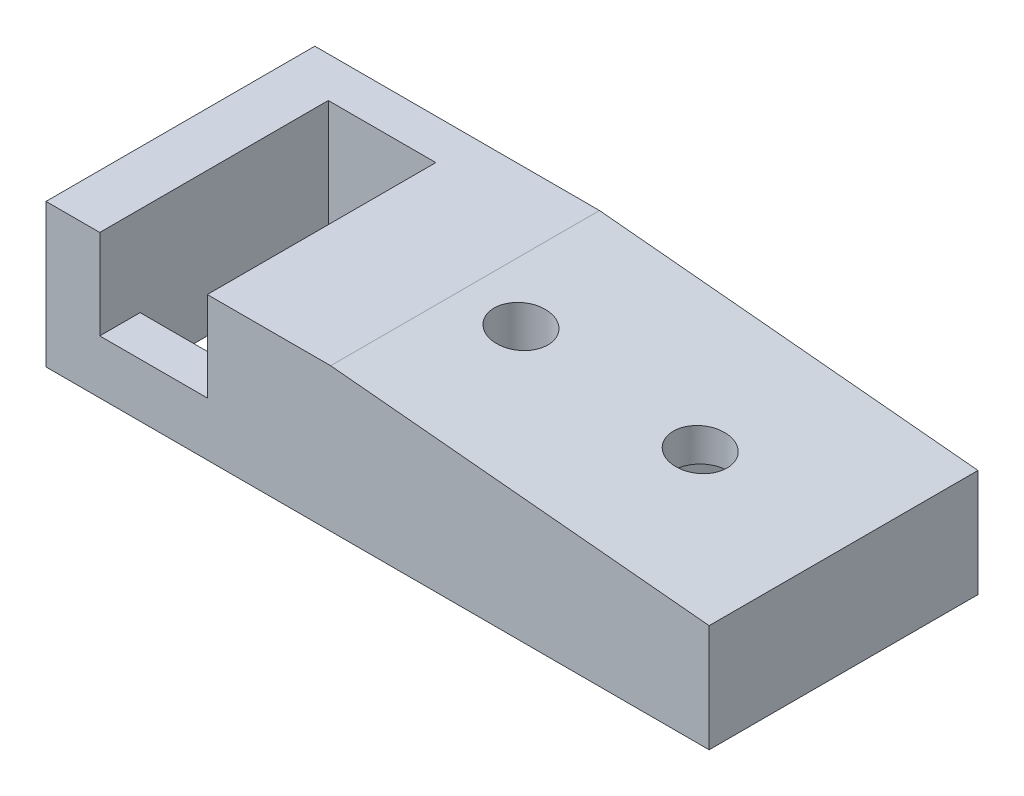
ISO-10303-21;
HEADER;
FILE_DESCRIPTION(('STEP AP214'),'2;1');
FILE_NAME('part.step','',(''),(''),'','','');
FILE_SCHEMA(('AUTOMOTIVE_DESIGN { 1 0 10303 214 1 1 1 1 }'));
ENDSEC;
DATA;
#1=APPLICATION_CONTEXT('core data for automotive mechanical design processes');
#2=APPLICATION_PROTOCOL_DEFINITION('international standard','automotive_design',2000,#1);
#3=PRODUCT_CONTEXT('',#1,'mechanical');
#4=PRODUCT('Part','Part','',(#3));
#5=PRODUCT_RELATED_PRODUCT_CATEGORY('part','',(#4));
#6=PRODUCT_DEFINITION_FORMATION('','',#4);
#7=PRODUCT_DEFINITION_CONTEXT('part definition',#1,'design');
#8=PRODUCT_DEFINITION('design','',#6,#7);
#9=PRODUCT_DEFINITION_SHAPE('','',#8);
#10=(LENGTH_UNIT() NAMED_UNIT(*) SI_UNIT(.MILLI.,.METRE.));
#11=(NAMED_UNIT(*) PLANE_ANGLE_UNIT() SI_UNIT($,.RADIAN.));
#12=(NAMED_UNIT(*) SI_UNIT($,.STERADIAN.) SOLID_ANGLE_UNIT());
#13=UNCERTAINTY_MEASURE_WITH_UNIT(LENGTH_MEASURE(1.E-05),#10,'distance_accuracy_value','');
#14=(GEOMETRIC_REPRESENTATION_CONTEXT(3) GLOBAL_UNCERTAINTY_ASSIGNED_CONTEXT((#13)) GLOBAL_UNIT_ASSIGNED_CONTEXT((#10,
#11,#12)) REPRESENTATION_CONTEXT('',''));
#15=CARTESIAN_POINT('',(0.,0.,0.));
#16=DIRECTION('',(0.,0.,1.));
#17=DIRECTION('',(1.,0.,0.));
#18=AXIS2_PLACEMENT_3D('',#15,#16,#17);
#19=CARTESIAN_POINT('',(5.,10.,2.5));
#20=DIRECTION('',(0.,-1.,0.));
#21=DIRECTION('',(0.,0.,-1.));
#22=AXIS2_PLACEMENT_3D('',#19,#20,#21);
#23=CYLINDRICAL_SURFACE('',#22,1.5);
#24=CARTESIAN_POINT('',(5.,2.,2.5));
#25=DIRECTION('',(0.,-1.,0.));
#26=DIRECTION('',(0.,0.,-1.));
#27=AXIS2_PLACEMENT_3D('',#24,#25,#26);
#28=CIRCLE('',#27,1.5);
#29=CARTESIAN_POINT('',(5.,2.,1.));
#30=VERTEX_POINT('',#29);
#31=EDGE_CURVE('E396',#30,#30,#28,.F.);
#32=ORIENTED_EDGE('',*,*,#31,.T.);
#33=EDGE_LOOP('',(#32));
#34=FACE_BOUND('',#33,.T.);
#35=CARTESIAN_POINT('',(5.,0.,2.5));
#36=DIRECTION('',(0.,-1.,0.));
#37=DIRECTION('',(0.,0.,-1.));
#38=AXIS2_PLACEMENT_3D('',#35,#36,#37);
#39=CIRCLE('',#38,1.5);
#40=CARTESIAN_POINT('',(5.,0.,1.));
#41=VERTEX_POINT('',#40);
#42=EDGE_CURVE('E243',#41,#41,#39,.T.);
#43=ORIENTED_EDGE('',*,*,#42,.T.);
#44=EDGE_LOOP('',(#43));
#45=FACE_BOUND('',#44,.T.);
#46=ADVANCED_FACE('F43',(#34,#45),#23,.F.);
#47=CARTESIAN_POINT('',(15.,10.,2.5));
#48=DIRECTION('',(0.,-1.,0.));
#49=DIRECTION('',(0.,0.,-1.));
#50=AXIS2_PLACEMENT_3D('',#47,#48,#49);
#51=CYLINDRICAL_SURFACE('',#50,1.5);
#52=CARTESIAN_POINT('',(15.,2.,2.5));
#53=DIRECTION('',(0.,-1.,0.));
#54=DIRECTION('',(0.,0.,-1.));
#55=AXIS2_PLACEMENT_3D('',#52,#53,#54);
#56=CIRCLE('',#55,1.5);
#57=CARTESIAN_POINT('',(15.,2.,0.999999999999999));
#58=VERTEX_POINT('',#57);
#59=EDGE_CURVE('E388',#58,#58,#56,.F.);
#60=ORIENTED_EDGE('',*,*,#59,.T.);
#61=EDGE_LOOP('',(#60));
#62=FACE_BOUND('',#61,.T.);
#63=CARTESIAN_POINT('',(15.,0.,2.5));
#64=DIRECTION('',(0.,-1.,0.));
#65=DIRECTION('',(0.,0.,-1.));
#66=AXIS2_PLACEMENT_3D('',#63,#64,#65);
#67=CIRCLE('',#66,1.5);
#68=CARTESIAN_POINT('',(15.,0.,0.999999999999999));
#69=VERTEX_POINT('',#68);
#70=EDGE_CURVE('E252',#69,#69,#67,.T.);
#71=ORIENTED_EDGE('',*,*,#70,.T.);
#72=EDGE_LOOP('',(#71));
#73=FACE_BOUND('',#72,.T.);
#74=ADVANCED_FACE('F447',(#62,#73),#51,.F.);
#75=CARTESIAN_POINT('',(23.,6.,5.));
#76=DIRECTION('',(-0.0942820702261732,-0.995545524440679,0.));
#77=DIRECTION('',(0.995545524440679,-0.0942820702261732,0.));
#78=AXIS2_PLACEMENT_3D('',#75,#76,#77);
#79=PLANE('',#78);
#80=DIRECTION('',(0.995545524440679,-0.0942820702261732,0.));
#81=VECTOR('',#80,1.);
#82=CARTESIAN_POINT('',(0.767622059913071,8.10549348752258,-5.));
#83=LINE('',#82,#81);
#84=CARTESIAN_POINT('',(1.88155145400466,8.,-5.));
#85=VERTEX_POINT('',#84);
#86=CARTESIAN_POINT('',(23.,6.,-5.));
#87=VERTEX_POINT('',#86);
#88=EDGE_CURVE('E287',#85,#87,#83,.T.);
#89=ORIENTED_EDGE('',*,*,#88,.F.);
#90=DIRECTION('',(0.,0.,-1.));
#91=VECTOR('',#90,1.);
#92=CARTESIAN_POINT('',(1.88155145400469,8.,0.));
#93=LINE('',#92,#91);
#94=CARTESIAN_POINT('',(1.88155145400466,8.,10.));
#95=VERTEX_POINT('',#94);
#96=EDGE_CURVE('E12',#95,#85,#93,.T.);
#97=ORIENTED_EDGE('',*,*,#96,.F.);
#98=DIRECTION('',(0.995545524440679,-0.0942820702261732,0.));
#99=VECTOR('',#98,1.);
#100=CARTESIAN_POINT('',(0.767622059913071,8.10549348752258,10.));
#101=LINE('',#100,#99);
#102=CARTESIAN_POINT('',(23.,6.,10.));
#103=VERTEX_POINT('',#102);
#104=EDGE_CURVE('E291',#95,#103,#101,.T.);
#105=ORIENTED_EDGE('',*,*,#104,.T.);
#106=DIRECTION('',(0.,0.,-1.));
#107=VECTOR('',#106,1.);
#108=CARTESIAN_POINT('',(23.,6.,5.));
#109=LINE('',#108,#107);
#110=EDGE_CURVE('E267',#103,#87,#109,.T.);
#111=ORIENTED_EDGE('',*,*,#110,.T.);
#112=EDGE_LOOP('',(#89,#97,#105,#111));
#113=FACE_BOUND('',#112,.T.);
#114=CARTESIAN_POINT('',(5.,7.7046706779427,2.5));
#115=DIRECTION('',(-0.0942820702261732,-0.995545524440679,0.));
#116=DIRECTION('',(0.995545524440679,-0.0942820702261732,0.));
#117=AXIS2_PLACEMENT_3D('',#114,#115,#116);
#118=ELLIPSE('',#117,1.50671161004188,1.5);
#119=CARTESIAN_POINT('',(6.5,7.56261478811415,2.5));
#120=VERTEX_POINT('',#119);
#121=EDGE_CURVE('E256',#120,#120,#118,.T.);
#122=ORIENTED_EDGE('',*,*,#121,.T.);
#123=EDGE_LOOP('',(#122));
#124=FACE_BOUND('',#123,.T.);
#125=CARTESIAN_POINT('',(15.,6.75763141241898,2.5));
#126=DIRECTION('',(-0.0942820702261732,-0.995545524440679,0.));
#127=DIRECTION('',(0.995545524440679,-0.0942820702261732,0.));
#128=AXIS2_PLACEMENT_3D('',#125,#126,#127);
#129=ELLIPSE('',#128,1.50671161004188,1.5);
#130=CARTESIAN_POINT('',(16.5,6.61557552259042,2.5));
#131=VERTEX_POINT('',#130);
#132=EDGE_CURVE('E263',#131,#131,#129,.T.);
#133=ORIENTED_EDGE('',*,*,#132,.T.);
#134=EDGE_LOOP('',(#133));
#135=FACE_BOUND('',#134,.T.);
#136=ADVANCED_FACE('F45',(#113,#124,#135),#79,.F.);
#137=CARTESIAN_POINT('',(0.,0.,5.));
#138=DIRECTION('',(0.,1.,0.));
#139=DIRECTION('',(0.,0.,1.));
#140=AXIS2_PLACEMENT_3D('',#137,#138,#139);
#141=PLANE('',#140);
#142=DIRECTION('',(0.,0.,-1.));
#143=VECTOR('',#142,1.);
#144=CARTESIAN_POINT('',(23.,0.,5.));
#145=LINE('',#144,#143);
#146=CARTESIAN_POINT('',(23.,0.,10.));
#147=VERTEX_POINT('',#146);
#148=CARTESIAN_POINT('',(23.,0.,-5.));
#149=VERTEX_POINT('',#148);
#150=EDGE_CURVE('E52',#147,#149,#145,.T.);
#151=ORIENTED_EDGE('',*,*,#150,.F.);
#152=DIRECTION('',(-1.,0.,0.));
#153=VECTOR('',#152,1.);
#154=CARTESIAN_POINT('',(23.,0.,10.));
#155=LINE('',#154,#153);
#156=CARTESIAN_POINT('',(-14.,0.,10.));
#157=VERTEX_POINT('',#156);
#158=EDGE_CURVE('E206',#147,#157,#155,.T.);
#159=ORIENTED_EDGE('',*,*,#158,.T.);
#160=DIRECTION('',(0.,0.,-1.));
#161=VECTOR('',#160,1.);
#162=CARTESIAN_POINT('',(-14.,0.,-5.));
#163=LINE('',#162,#161);
#164=CARTESIAN_POINT('',(-14.,0.,-5.));
#165=VERTEX_POINT('',#164);
#166=EDGE_CURVE('E232',#157,#165,#163,.T.);
#167=ORIENTED_EDGE('',*,*,#166,.T.);
#168=DIRECTION('',(1.,0.,0.));
#169=VECTOR('',#168,1.);
#170=CARTESIAN_POINT('',(23.,0.,-5.));
#171=LINE('',#170,#169);
#172=EDGE_CURVE('E236',#165,#149,#171,.T.);
#173=ORIENTED_EDGE('',*,*,#172,.T.);
#174=EDGE_LOOP('',(#151,#159,#167,#173));
#175=FACE_BOUND('',#174,.T.);
#176=ORIENTED_EDGE('',*,*,#70,.F.);
#177=EDGE_LOOP('',(#176));
#178=FACE_BOUND('',#177,.T.);
#179=ORIENTED_EDGE('',*,*,#42,.F.);
#180=EDGE_LOOP('',(#179));
#181=FACE_BOUND('',#180,.T.);
#182=DIRECTION('',(1.,0.,0.));
#183=VECTOR('',#182,1.);
#184=CARTESIAN_POINT('',(-11.,0.,-2.75));
#185=LINE('',#184,#183);
#186=CARTESIAN_POINT('',(-11.,0.,-2.75));
#187=VERTEX_POINT('',#186);
#188=CARTESIAN_POINT('',(-5.,0.,-2.75));
#189=VERTEX_POINT('',#188);
#190=EDGE_CURVE('E400',#187,#189,#185,.T.);
#191=ORIENTED_EDGE('',*,*,#190,.F.);
#192=DIRECTION('',(0.,0.,-1.));
#193=VECTOR('',#192,1.);
#194=CARTESIAN_POINT('',(-11.,0.,-2.75));
#195=LINE('',#194,#193);
#196=CARTESIAN_POINT('',(-11.,0.,7.75));
#197=VERTEX_POINT('',#196);
#198=EDGE_CURVE('E406',#197,#187,#195,.T.);
#199=ORIENTED_EDGE('',*,*,#198,.F.);
#200=DIRECTION('',(-1.,0.,0.));
#201=VECTOR('',#200,1.);
#202=CARTESIAN_POINT('',(-11.,0.,7.75));
#203=LINE('',#202,#201);
#204=CARTESIAN_POINT('',(-5.,0.,7.75));
#205=VERTEX_POINT('',#204);
#206=EDGE_CURVE('E198',#205,#197,#203,.T.);
#207=ORIENTED_EDGE('',*,*,#206,.F.);
#208=DIRECTION('',(0.,0.,1.));
#209=VECTOR('',#208,1.);
#210=CARTESIAN_POINT('',(-5.,0.,7.75));
#211=LINE('',#210,#209);
#212=EDGE_CURVE('E414',#189,#205,#211,.T.);
#213=ORIENTED_EDGE('',*,*,#212,.F.);
#214=EDGE_LOOP('',(#191,#199,#207,#213));
#215=FACE_BOUND('',#214,.T.);
#216=ADVANCED_FACE('F279',(#175,#178,#181,#215),#141,.F.);
#217=CARTESIAN_POINT('',(23.,0.,5.));
#218=DIRECTION('',(-1.,0.,0.));
#219=DIRECTION('',(0.,0.,1.));
#220=AXIS2_PLACEMENT_3D('',#217,#218,#219);
#221=PLANE('',#220);
#222=DIRECTION('',(0.,-1.,0.));
#223=VECTOR('',#222,1.);
#224=CARTESIAN_POINT('',(23.,8.,-5.));
#225=LINE('',#224,#223);
#226=EDGE_CURVE('E240',#87,#149,#225,.T.);
#227=ORIENTED_EDGE('',*,*,#226,.F.);
#228=ORIENTED_EDGE('',*,*,#110,.F.);
#229=DIRECTION('',(0.,-1.,0.));
#230=VECTOR('',#229,1.);
#231=CARTESIAN_POINT('',(23.,8.,10.));
#232=LINE('',#231,#230);
#233=EDGE_CURVE('E228',#103,#147,#232,.T.);
#234=ORIENTED_EDGE('',*,*,#233,.T.);
#235=ORIENTED_EDGE('',*,*,#150,.T.);
#236=EDGE_LOOP('',(#227,#228,#234,#235));
#237=FACE_BOUND('',#236,.T.);
#238=ADVANCED_FACE('F274',(#237),#221,.F.);
#239=CARTESIAN_POINT('',(5.,5.,2.5));
#240=DIRECTION('',(0.,1.,0.));
#241=DIRECTION('',(0.,0.,1.));
#242=AXIS2_PLACEMENT_3D('',#239,#240,#241);
#243=CIRCLE('',#242,1.5);
#244=CARTESIAN_POINT('',(5.,5.,4.));
#245=VERTEX_POINT('',#244);
#246=EDGE_CURVE('E392',#245,#245,#243,.F.);
#247=ORIENTED_EDGE('',*,*,#246,.T.);
#248=EDGE_LOOP('',(#247));
#249=FACE_BOUND('',#248,.T.);
#250=ORIENTED_EDGE('',*,*,#121,.F.);
#251=EDGE_LOOP('',(#250));
#252=FACE_BOUND('',#251,.T.);
#253=ADVANCED_FACE('F454',(#249,#252),#23,.F.);
#254=CARTESIAN_POINT('',(15.,5.,2.5));
#255=DIRECTION('',(0.,1.,0.));
#256=DIRECTION('',(-1.,0.,0.));
#257=AXIS2_PLACEMENT_3D('',#254,#255,#256);
#258=CIRCLE('',#257,1.5);
#259=CARTESIAN_POINT('',(13.5,5.,2.5));
#260=VERTEX_POINT('',#259);
#261=EDGE_CURVE('E338',#260,#260,#258,.F.);
#262=ORIENTED_EDGE('',*,*,#261,.T.);
#263=EDGE_LOOP('',(#262));
#264=FACE_BOUND('',#263,.T.);
#265=ORIENTED_EDGE('',*,*,#132,.F.);
#266=EDGE_LOOP('',(#265));
#267=FACE_BOUND('',#266,.T.);
#268=ADVANCED_FACE('F452',(#264,#267),#51,.F.);
#269=CARTESIAN_POINT('',(23.,8.,-5.));
#270=DIRECTION('',(0.,0.,-1.));
#271=DIRECTION('',(-1.,0.,0.));
#272=AXIS2_PLACEMENT_3D('',#269,#270,#271);
#273=PLANE('',#272);
#274=ORIENTED_EDGE('',*,*,#88,.T.);
#275=ORIENTED_EDGE('',*,*,#226,.T.);
#276=ORIENTED_EDGE('',*,*,#172,.F.);
#277=DIRECTION('',(0.,-1.,0.));
#278=VECTOR('',#277,1.);
#279=CARTESIAN_POINT('',(-14.,8.,-5.));
#280=LINE('',#279,#278);
#281=CARTESIAN_POINT('',(-14.,8.,-5.));
#282=VERTEX_POINT('',#281);
#283=EDGE_CURVE('E244',#282,#165,#280,.T.);
#284=ORIENTED_EDGE('',*,*,#283,.F.);
#285=DIRECTION('',(1.,0.,0.));
#286=VECTOR('',#285,1.);
#287=CARTESIAN_POINT('',(23.,8.,-5.));
#288=LINE('',#287,#286);
#289=EDGE_CURVE('E225',#282,#85,#288,.T.);
#290=ORIENTED_EDGE('',*,*,#289,.T.);
#291=EDGE_LOOP('',(#274,#275,#276,#284,#290));
#292=FACE_BOUND('',#291,.T.);
#293=DIRECTION('',(0.,1.,0.));
#294=VECTOR('',#293,1.);
#295=CARTESIAN_POINT('',(7.75,2.,-5.));
#296=LINE('',#295,#294);
#297=CARTESIAN_POINT('',(7.75,2.,-5.));
#298=VERTEX_POINT('',#297);
#299=CARTESIAN_POINT('',(7.75,5.,-5.));
#300=VERTEX_POINT('',#299);
#301=EDGE_CURVE('E303',#298,#300,#296,.T.);
#302=ORIENTED_EDGE('',*,*,#301,.T.);
#303=DIRECTION('',(-1.,0.,0.));
#304=VECTOR('',#303,1.);
#305=CARTESIAN_POINT('',(2.25,5.,-5.));
#306=LINE('',#305,#304);
#307=CARTESIAN_POINT('',(2.25,5.,-5.));
#308=VERTEX_POINT('',#307);
#309=EDGE_CURVE('E307',#300,#308,#306,.T.);
#310=ORIENTED_EDGE('',*,*,#309,.T.);
#311=DIRECTION('',(0.,-1.,0.));
#312=VECTOR('',#311,1.);
#313=CARTESIAN_POINT('',(2.25,2.,-5.));
#314=LINE('',#313,#312);
#315=CARTESIAN_POINT('',(2.25,2.,-5.));
#316=VERTEX_POINT('',#315);
#317=EDGE_CURVE('E65',#308,#316,#314,.T.);
#318=ORIENTED_EDGE('',*,*,#317,.T.);
#319=DIRECTION('',(1.,0.,0.));
#320=VECTOR('',#319,1.);
#321=CARTESIAN_POINT('',(2.25,2.,-5.));
#322=LINE('',#321,#320);
#323=EDGE_CURVE('E314',#316,#298,#322,.T.);
#324=ORIENTED_EDGE('',*,*,#323,.T.);
#325=EDGE_LOOP('',(#302,#310,#318,#324));
#326=FACE_BOUND('',#325,.T.);
#327=DIRECTION('',(0.,1.,0.));
#328=VECTOR('',#327,1.);
#329=CARTESIAN_POINT('',(17.75,5.,-5.));
#330=LINE('',#329,#328);
#331=CARTESIAN_POINT('',(17.75,2.,-5.));
#332=VERTEX_POINT('',#331);
#333=CARTESIAN_POINT('',(17.75,5.,-5.));
#334=VERTEX_POINT('',#333);
#335=EDGE_CURVE('E347',#332,#334,#330,.T.);
#336=ORIENTED_EDGE('',*,*,#335,.T.);
#337=DIRECTION('',(-1.,0.,0.));
#338=VECTOR('',#337,1.);
#339=CARTESIAN_POINT('',(12.25,5.,-5.));
#340=LINE('',#339,#338);
#341=CARTESIAN_POINT('',(12.25,5.,-5.));
#342=VERTEX_POINT('',#341);
#343=EDGE_CURVE('E351',#334,#342,#340,.T.);
#344=ORIENTED_EDGE('',*,*,#343,.T.);
#345=DIRECTION('',(0.,-1.,0.));
#346=VECTOR('',#345,1.);
#347=CARTESIAN_POINT('',(12.25,5.,-5.));
#348=LINE('',#347,#346);
#349=CARTESIAN_POINT('',(12.25,2.,-5.));
#350=VERTEX_POINT('',#349);
#351=EDGE_CURVE('E356',#342,#350,#348,.T.);
#352=ORIENTED_EDGE('',*,*,#351,.T.);
#353=DIRECTION('',(1.,0.,0.));
#354=VECTOR('',#353,1.);
#355=CARTESIAN_POINT('',(12.25,2.,-5.));
#356=LINE('',#355,#354);
#357=EDGE_CURVE('E360',#350,#332,#356,.T.);
#358=ORIENTED_EDGE('',*,*,#357,.T.);
#359=EDGE_LOOP('',(#336,#344,#352,#358));
#360=FACE_BOUND('',#359,.T.);
#361=ADVANCED_FACE('F284',(#292,#326,#360),#273,.T.);
#362=CARTESIAN_POINT('',(-14.,8.,-5.));
#363=DIRECTION('',(-1.,0.,0.));
#364=DIRECTION('',(0.,0.,1.));
#365=AXIS2_PLACEMENT_3D('',#362,#363,#364);
#366=PLANE('',#365);
#367=ORIENTED_EDGE('',*,*,#166,.F.);
#368=DIRECTION('',(0.,-1.,0.));
#369=VECTOR('',#368,1.);
#370=CARTESIAN_POINT('',(-14.,8.,10.));
#371=LINE('',#370,#369);
#372=CARTESIAN_POINT('',(-14.,8.,10.));
#373=VERTEX_POINT('',#372);
#374=EDGE_CURVE('E247',#373,#157,#371,.T.);
#375=ORIENTED_EDGE('',*,*,#374,.F.);
#376=DIRECTION('',(0.,0.,-1.));
#377=VECTOR('',#376,1.);
#378=CARTESIAN_POINT('',(-14.,8.,-5.));
#379=LINE('',#378,#377);
#380=EDGE_CURVE('E220',#373,#282,#379,.T.);
#381=ORIENTED_EDGE('',*,*,#380,.T.);
#382=ORIENTED_EDGE('',*,*,#283,.T.);
#383=EDGE_LOOP('',(#367,#375,#381,#382));
#384=FACE_BOUND('',#383,.T.);
#385=ADVANCED_FACE('F461',(#384),#366,.T.);
#386=CARTESIAN_POINT('',(23.,8.,10.));
#387=DIRECTION('',(0.,0.,1.));
#388=DIRECTION('',(1.,0.,0.));
#389=AXIS2_PLACEMENT_3D('',#386,#387,#388);
#390=PLANE('',#389);
#391=DIRECTION('',(0.,1.,0.));
#392=VECTOR('',#391,1.);
#393=CARTESIAN_POINT('',(-5.,3.,10.));
#394=LINE('',#393,#392);
#395=CARTESIAN_POINT('',(-5.,3.,10.));
#396=VERTEX_POINT('',#395);
#397=CARTESIAN_POINT('',(-5.,8.,10.));
#398=VERTEX_POINT('',#397);
#399=EDGE_CURVE('E299',#396,#398,#394,.T.);
#400=ORIENTED_EDGE('',*,*,#399,.F.);
#401=DIRECTION('',(1.,0.,0.));
#402=VECTOR('',#401,1.);
#403=CARTESIAN_POINT('',(-5.,3.,10.));
#404=LINE('',#403,#402);
#405=CARTESIAN_POINT('',(-11.,3.,10.));
#406=VERTEX_POINT('',#405);
#407=EDGE_CURVE('E185',#406,#396,#404,.T.);
#408=ORIENTED_EDGE('',*,*,#407,.F.);
#409=DIRECTION('',(0.,1.,0.));
#410=VECTOR('',#409,1.);
#411=CARTESIAN_POINT('',(-11.,3.,10.));
#412=LINE('',#411,#410);
#413=CARTESIAN_POINT('',(-11.,8.,10.));
#414=VERTEX_POINT('',#413);
#415=EDGE_CURVE('E181',#406,#414,#412,.T.);
#416=ORIENTED_EDGE('',*,*,#415,.T.);
#417=DIRECTION('',(-1.,0.,0.));
#418=VECTOR('',#417,1.);
#419=CARTESIAN_POINT('',(23.,8.,10.));
#420=LINE('',#419,#418);
#421=EDGE_CURVE('E221',#414,#373,#420,.T.);
#422=ORIENTED_EDGE('',*,*,#421,.T.);
#423=ORIENTED_EDGE('',*,*,#374,.T.);
#424=ORIENTED_EDGE('',*,*,#158,.F.);
#425=ORIENTED_EDGE('',*,*,#233,.F.);
#426=ORIENTED_EDGE('',*,*,#104,.F.);
#427=EDGE_CURVE('E216',#95,#398,#420,.T.);
#428=ORIENTED_EDGE('',*,*,#427,.T.);
#429=EDGE_LOOP('',(#400,#408,#416,#422,#423,#424,#425,#426,#428));
#430=FACE_BOUND('',#429,.T.);
#431=ADVANCED_FACE('F435',(#430),#390,.T.);
#432=CARTESIAN_POINT('',(0.,8.,0.));
#433=DIRECTION('',(0.,-1.,0.));
#434=DIRECTION('',(0.,0.,-1.));
#435=AXIS2_PLACEMENT_3D('',#432,#433,#434);
#436=PLANE('',#435);
#437=DIRECTION('',(0.,0.,1.));
#438=VECTOR('',#437,1.);
#439=CARTESIAN_POINT('',(-5.,8.,7.75));
#440=LINE('',#439,#438);
#441=CARTESIAN_POINT('',(-5.,8.,-2.75));
#442=VERTEX_POINT('',#441);
#443=EDGE_CURVE('E405',#442,#398,#440,.T.);
#444=ORIENTED_EDGE('',*,*,#443,.T.);
#445=ORIENTED_EDGE('',*,*,#427,.F.);
#446=ORIENTED_EDGE('',*,*,#96,.T.);
#447=ORIENTED_EDGE('',*,*,#289,.F.);
#448=ORIENTED_EDGE('',*,*,#380,.F.);
#449=ORIENTED_EDGE('',*,*,#421,.F.);
#450=DIRECTION('',(0.,0.,-1.));
#451=VECTOR('',#450,1.);
#452=CARTESIAN_POINT('',(-11.,8.,-2.75));
#453=LINE('',#452,#451);
#454=CARTESIAN_POINT('',(-11.,8.,-2.75));
#455=VERTEX_POINT('',#454);
#456=EDGE_CURVE('E215',#414,#455,#453,.T.);
#457=ORIENTED_EDGE('',*,*,#456,.T.);
#458=DIRECTION('',(1.,0.,0.));
#459=VECTOR('',#458,1.);
#460=CARTESIAN_POINT('',(-11.,8.,-2.75));
#461=LINE('',#460,#459);
#462=EDGE_CURVE('E401',#455,#442,#461,.T.);
#463=ORIENTED_EDGE('',*,*,#462,.T.);
#464=EDGE_LOOP('',(#444,#445,#446,#447,#448,#449,#457,#463));
#465=FACE_BOUND('',#464,.T.);
#466=ADVANCED_FACE('F431',(#465),#436,.F.);
#467=CARTESIAN_POINT('',(-11.,8.,-2.75));
#468=DIRECTION('',(0.,0.,-1.));
#469=DIRECTION('',(-1.,0.,0.));
#470=AXIS2_PLACEMENT_3D('',#467,#468,#469);
#471=PLANE('',#470);
#472=ORIENTED_EDGE('',*,*,#190,.T.);
#473=DIRECTION('',(0.,-1.,0.));
#474=VECTOR('',#473,1.);
#475=CARTESIAN_POINT('',(-5.,8.,-2.75));
#476=LINE('',#475,#474);
#477=EDGE_CURVE('E208',#442,#189,#476,.T.);
#478=ORIENTED_EDGE('',*,*,#477,.F.);
#479=ORIENTED_EDGE('',*,*,#462,.F.);
#480=DIRECTION('',(0.,-1.,0.));
#481=VECTOR('',#480,1.);
#482=CARTESIAN_POINT('',(-11.,8.,-2.75));
#483=LINE('',#482,#481);
#484=EDGE_CURVE('E201',#455,#187,#483,.T.);
#485=ORIENTED_EDGE('',*,*,#484,.T.);
#486=EDGE_LOOP('',(#472,#478,#479,#485));
#487=FACE_BOUND('',#486,.T.);
#488=ADVANCED_FACE('F425',(#487),#471,.F.);
#489=CARTESIAN_POINT('',(-11.,8.,-2.75));
#490=DIRECTION('',(-1.,0.,0.));
#491=DIRECTION('',(0.,0.,1.));
#492=AXIS2_PLACEMENT_3D('',#489,#490,#491);
#493=PLANE('',#492);
#494=ORIENTED_EDGE('',*,*,#198,.T.);
#495=ORIENTED_EDGE('',*,*,#484,.F.);
#496=ORIENTED_EDGE('',*,*,#456,.F.);
#497=ORIENTED_EDGE('',*,*,#415,.F.);
#498=DIRECTION('',(0.,0.,1.));
#499=VECTOR('',#498,1.);
#500=CARTESIAN_POINT('',(-11.,3.,7.75));
#501=LINE('',#500,#499);
#502=CARTESIAN_POINT('',(-11.,3.,7.75));
#503=VERTEX_POINT('',#502);
#504=EDGE_CURVE('E173',#503,#406,#501,.T.);
#505=ORIENTED_EDGE('',*,*,#504,.F.);
#506=DIRECTION('',(0.,-1.,0.));
#507=VECTOR('',#506,1.);
#508=CARTESIAN_POINT('',(-11.,8.,7.75));
#509=LINE('',#508,#507);
#510=EDGE_CURVE('E178',#503,#197,#509,.T.);
#511=ORIENTED_EDGE('',*,*,#510,.T.);
#512=EDGE_LOOP('',(#494,#495,#496,#497,#505,#511));
#513=FACE_BOUND('',#512,.T.);
#514=ADVANCED_FACE('F176',(#513),#493,.F.);
#515=CARTESIAN_POINT('',(-11.,8.,7.75));
#516=DIRECTION('',(0.,0.,1.));
#517=DIRECTION('',(1.,0.,0.));
#518=AXIS2_PLACEMENT_3D('',#515,#516,#517);
#519=PLANE('',#518);
#520=ORIENTED_EDGE('',*,*,#510,.F.);
#521=DIRECTION('',(-1.,0.,0.));
#522=VECTOR('',#521,1.);
#523=CARTESIAN_POINT('',(-11.,3.,7.75));
#524=LINE('',#523,#522);
#525=CARTESIAN_POINT('',(-5.,3.,7.75));
#526=VERTEX_POINT('',#525);
#527=EDGE_CURVE('E186',#526,#503,#524,.T.);
#528=ORIENTED_EDGE('',*,*,#527,.F.);
#529=DIRECTION('',(0.,-1.,0.));
#530=VECTOR('',#529,1.);
#531=CARTESIAN_POINT('',(-5.,8.,7.75));
#532=LINE('',#531,#530);
#533=EDGE_CURVE('E202',#526,#205,#532,.T.);
#534=ORIENTED_EDGE('',*,*,#533,.T.);
#535=ORIENTED_EDGE('',*,*,#206,.T.);
#536=EDGE_LOOP('',(#520,#528,#534,#535));
#537=FACE_BOUND('',#536,.T.);
#538=ADVANCED_FACE('F196',(#537),#519,.F.);
#539=CARTESIAN_POINT('',(-5.,8.,7.75));
#540=DIRECTION('',(1.,0.,0.));
#541=DIRECTION('',(0.,0.,-1.));
#542=AXIS2_PLACEMENT_3D('',#539,#540,#541);
#543=PLANE('',#542);
#544=ORIENTED_EDGE('',*,*,#212,.T.);
#545=ORIENTED_EDGE('',*,*,#533,.F.);
#546=DIRECTION('',(0.,0.,-1.));
#547=VECTOR('',#546,1.);
#548=CARTESIAN_POINT('',(-5.,3.,7.75));
#549=LINE('',#548,#547);
#550=EDGE_CURVE('E191',#396,#526,#549,.T.);
#551=ORIENTED_EDGE('',*,*,#550,.F.);
#552=ORIENTED_EDGE('',*,*,#399,.T.);
#553=ORIENTED_EDGE('',*,*,#443,.F.);
#554=ORIENTED_EDGE('',*,*,#477,.T.);
#555=EDGE_LOOP('',(#544,#545,#551,#552,#553,#554));
#556=FACE_BOUND('',#555,.T.);
#557=ADVANCED_FACE('F428',(#556),#543,.F.);
#558=CARTESIAN_POINT('',(12.25,2.,-5.));
#559=DIRECTION('',(0.,-1.,0.));
#560=DIRECTION('',(0.,0.,-1.));
#561=AXIS2_PLACEMENT_3D('',#558,#559,#560);
#562=PLANE('',#561);
#563=DIRECTION('',(1.,0.,0.));
#564=VECTOR('',#563,1.);
#565=CARTESIAN_POINT('',(12.25,2.,5.));
#566=LINE('',#565,#564);
#567=CARTESIAN_POINT('',(12.25,2.,5.));
#568=VERTEX_POINT('',#567);
#569=CARTESIAN_POINT('',(17.75,2.,5.));
#570=VERTEX_POINT('',#569);
#571=EDGE_CURVE('E352',#568,#570,#566,.T.);
#572=ORIENTED_EDGE('',*,*,#571,.T.);
#573=DIRECTION('',(0.,0.,1.));
#574=VECTOR('',#573,1.);
#575=CARTESIAN_POINT('',(17.75,2.,-5.));
#576=LINE('',#575,#574);
#577=EDGE_CURVE('E324',#332,#570,#576,.T.);
#578=ORIENTED_EDGE('',*,*,#577,.F.);
#579=ORIENTED_EDGE('',*,*,#357,.F.);
#580=DIRECTION('',(0.,0.,1.));
#581=VECTOR('',#580,1.);
#582=CARTESIAN_POINT('',(12.25,2.,-5.));
#583=LINE('',#582,#581);
#584=EDGE_CURVE('E377',#350,#568,#583,.T.);
#585=ORIENTED_EDGE('',*,*,#584,.T.);
#586=EDGE_LOOP('',(#572,#578,#579,#585));
#587=FACE_BOUND('',#586,.T.);
#588=ORIENTED_EDGE('',*,*,#59,.F.);
#589=EDGE_LOOP('',(#588));
#590=FACE_BOUND('',#589,.T.);
#591=ADVANCED_FACE('F503',(#587,#590),#562,.F.);
#592=CARTESIAN_POINT('',(12.25,5.,-5.));
#593=DIRECTION('',(0.,1.,0.));
#594=DIRECTION('',(-1.,0.,0.));
#595=AXIS2_PLACEMENT_3D('',#592,#593,#594);
#596=PLANE('',#595);
#597=DIRECTION('',(-1.,0.,0.));
#598=VECTOR('',#597,1.);
#599=CARTESIAN_POINT('',(12.25,5.,5.));
#600=LINE('',#599,#598);
#601=CARTESIAN_POINT('',(17.75,5.,5.));
#602=VERTEX_POINT('',#601);
#603=CARTESIAN_POINT('',(12.25,5.,5.));
#604=VERTEX_POINT('',#603);
#605=EDGE_CURVE('E296',#602,#604,#600,.T.);
#606=ORIENTED_EDGE('',*,*,#605,.T.);
#607=DIRECTION('',(0.,0.,1.));
#608=VECTOR('',#607,1.);
#609=CARTESIAN_POINT('',(12.25,5.,-5.));
#610=LINE('',#609,#608);
#611=EDGE_CURVE('E380',#342,#604,#610,.T.);
#612=ORIENTED_EDGE('',*,*,#611,.F.);
#613=ORIENTED_EDGE('',*,*,#343,.F.);
#614=DIRECTION('',(0.,0.,1.));
#615=VECTOR('',#614,1.);
#616=CARTESIAN_POINT('',(17.75,5.,-5.));
#617=LINE('',#616,#615);
#618=EDGE_CURVE('E363',#334,#602,#617,.T.);
#619=ORIENTED_EDGE('',*,*,#618,.T.);
#620=EDGE_LOOP('',(#606,#612,#613,#619));
#621=FACE_BOUND('',#620,.T.);
#622=ORIENTED_EDGE('',*,*,#261,.F.);
#623=EDGE_LOOP('',(#622));
#624=FACE_BOUND('',#623,.T.);
#625=ADVANCED_FACE('F508',(#621,#624),#596,.F.);
#626=CARTESIAN_POINT('',(17.75,5.,-5.));
#627=DIRECTION('',(1.,0.,0.));
#628=DIRECTION('',(0.,0.,-1.));
#629=AXIS2_PLACEMENT_3D('',#626,#627,#628);
#630=PLANE('',#629);
#631=DIRECTION('',(0.,1.,0.));
#632=VECTOR('',#631,1.);
#633=CARTESIAN_POINT('',(17.75,5.,5.));
#634=LINE('',#633,#632);
#635=EDGE_CURVE('E290',#570,#602,#634,.T.);
#636=ORIENTED_EDGE('',*,*,#635,.T.);
#637=ORIENTED_EDGE('',*,*,#618,.F.);
#638=ORIENTED_EDGE('',*,*,#335,.F.);
#639=ORIENTED_EDGE('',*,*,#577,.T.);
#640=EDGE_LOOP('',(#636,#637,#638,#639));
#641=FACE_BOUND('',#640,.T.);
#642=ADVANCED_FACE('F520',(#641),#630,.F.);
#643=CARTESIAN_POINT('',(12.25,5.,-5.));
#644=DIRECTION('',(-1.,0.,0.));
#645=DIRECTION('',(0.,0.,1.));
#646=AXIS2_PLACEMENT_3D('',#643,#644,#645);
#647=PLANE('',#646);
#648=DIRECTION('',(0.,-1.,0.));
#649=VECTOR('',#648,1.);
#650=CARTESIAN_POINT('',(12.25,5.,5.));
#651=LINE('',#650,#649);
#652=EDGE_CURVE('E368',#604,#568,#651,.T.);
#653=ORIENTED_EDGE('',*,*,#652,.T.);
#654=ORIENTED_EDGE('',*,*,#584,.F.);
#655=ORIENTED_EDGE('',*,*,#351,.F.);
#656=ORIENTED_EDGE('',*,*,#611,.T.);
#657=EDGE_LOOP('',(#653,#654,#655,#656));
#658=FACE_BOUND('',#657,.T.);
#659=ADVANCED_FACE('F530',(#658),#647,.F.);
#660=CARTESIAN_POINT('',(0.,0.,5.));
#661=DIRECTION('',(0.,0.,1.));
#662=DIRECTION('',(1.,0.,0.));
#663=AXIS2_PLACEMENT_3D('',#660,#661,#662);
#664=PLANE('',#663);
#665=ORIENTED_EDGE('',*,*,#635,.F.);
#666=ORIENTED_EDGE('',*,*,#571,.F.);
#667=ORIENTED_EDGE('',*,*,#652,.F.);
#668=ORIENTED_EDGE('',*,*,#605,.F.);
#669=EDGE_LOOP('',(#665,#666,#667,#668));
#670=FACE_BOUND('',#669,.T.);
#671=ADVANCED_FACE('F540',(#670),#664,.F.);
#672=CARTESIAN_POINT('',(2.25,2.,-5.));
#673=DIRECTION('',(0.,-1.,0.));
#674=DIRECTION('',(0.,0.,-1.));
#675=AXIS2_PLACEMENT_3D('',#672,#673,#674);
#676=PLANE('',#675);
#677=DIRECTION('',(1.,0.,0.));
#678=VECTOR('',#677,1.);
#679=CARTESIAN_POINT('',(2.25,2.,5.));
#680=LINE('',#679,#678);
#681=CARTESIAN_POINT('',(2.25,2.,5.));
#682=VERTEX_POINT('',#681);
#683=CARTESIAN_POINT('',(7.75,2.,5.));
#684=VERTEX_POINT('',#683);
#685=EDGE_CURVE('E308',#682,#684,#680,.T.);
#686=ORIENTED_EDGE('',*,*,#685,.T.);
#687=DIRECTION('',(0.,0.,1.));
#688=VECTOR('',#687,1.);
#689=CARTESIAN_POINT('',(7.75,2.,-5.));
#690=LINE('',#689,#688);
#691=EDGE_CURVE('E335',#298,#684,#690,.T.);
#692=ORIENTED_EDGE('',*,*,#691,.F.);
#693=ORIENTED_EDGE('',*,*,#323,.F.);
#694=DIRECTION('',(0.,0.,1.));
#695=VECTOR('',#694,1.);
#696=CARTESIAN_POINT('',(2.25,2.,-5.));
#697=LINE('',#696,#695);
#698=EDGE_CURVE('E339',#316,#682,#697,.T.);
#699=ORIENTED_EDGE('',*,*,#698,.T.);
#700=EDGE_LOOP('',(#686,#692,#693,#699));
#701=FACE_BOUND('',#700,.T.);
#702=ORIENTED_EDGE('',*,*,#31,.F.);
#703=EDGE_LOOP('',(#702));
#704=FACE_BOUND('',#703,.T.);
#705=ADVANCED_FACE('F550',(#701,#704),#676,.F.);
#706=CARTESIAN_POINT('',(2.25,5.,-5.));
#707=DIRECTION('',(0.,1.,0.));
#708=DIRECTION('',(0.,0.,1.));
#709=AXIS2_PLACEMENT_3D('',#706,#707,#708);
#710=PLANE('',#709);
#711=DIRECTION('',(-1.,0.,0.));
#712=VECTOR('',#711,1.);
#713=CARTESIAN_POINT('',(2.25,5.,5.));
#714=LINE('',#713,#712);
#715=CARTESIAN_POINT('',(7.75,5.,5.));
#716=VERTEX_POINT('',#715);
#717=CARTESIAN_POINT('',(2.25,5.,5.));
#718=VERTEX_POINT('',#717);
#719=EDGE_CURVE('E323',#716,#718,#714,.T.);
#720=ORIENTED_EDGE('',*,*,#719,.T.);
#721=DIRECTION('',(0.,0.,1.));
#722=VECTOR('',#721,1.);
#723=CARTESIAN_POINT('',(2.25,5.,-5.));
#724=LINE('',#723,#722);
#725=EDGE_CURVE('E342',#308,#718,#724,.T.);
#726=ORIENTED_EDGE('',*,*,#725,.F.);
#727=ORIENTED_EDGE('',*,*,#309,.F.);
#728=DIRECTION('',(0.,0.,1.));
#729=VECTOR('',#728,1.);
#730=CARTESIAN_POINT('',(7.75,5.,-5.));
#731=LINE('',#730,#729);
#732=EDGE_CURVE('E318',#300,#716,#731,.T.);
#733=ORIENTED_EDGE('',*,*,#732,.T.);
#734=EDGE_LOOP('',(#720,#726,#727,#733));
#735=FACE_BOUND('',#734,.T.);
#736=ORIENTED_EDGE('',*,*,#246,.F.);
#737=EDGE_LOOP('',(#736));
#738=FACE_BOUND('',#737,.T.);
#739=ADVANCED_FACE('F560',(#735,#738),#710,.F.);
#740=CARTESIAN_POINT('',(7.75,2.,-5.));
#741=DIRECTION('',(1.,0.,0.));
#742=DIRECTION('',(0.,0.,-1.));
#743=AXIS2_PLACEMENT_3D('',#740,#741,#742);
#744=PLANE('',#743);
#745=DIRECTION('',(0.,1.,0.));
#746=VECTOR('',#745,1.);
#747=CARTESIAN_POINT('',(7.75,2.,5.));
#748=LINE('',#747,#746);
#749=EDGE_CURVE('E319',#684,#716,#748,.T.);
#750=ORIENTED_EDGE('',*,*,#749,.T.);
#751=ORIENTED_EDGE('',*,*,#732,.F.);
#752=ORIENTED_EDGE('',*,*,#301,.F.);
#753=ORIENTED_EDGE('',*,*,#691,.T.);
#754=EDGE_LOOP('',(#750,#751,#752,#753));
#755=FACE_BOUND('',#754,.T.);
#756=ADVANCED_FACE('F570',(#755),#744,.F.);
#757=CARTESIAN_POINT('',(2.25,2.,-5.));
#758=DIRECTION('',(-1.,0.,0.));
#759=DIRECTION('',(0.,-1.,0.));
#760=AXIS2_PLACEMENT_3D('',#757,#758,#759);
#761=PLANE('',#760);
#762=DIRECTION('',(0.,-1.,0.));
#763=VECTOR('',#762,1.);
#764=CARTESIAN_POINT('',(2.25,2.,5.));
#765=LINE('',#764,#763);
#766=EDGE_CURVE('E328',#718,#682,#765,.T.);
#767=ORIENTED_EDGE('',*,*,#766,.T.);
#768=ORIENTED_EDGE('',*,*,#698,.F.);
#769=ORIENTED_EDGE('',*,*,#317,.F.);
#770=ORIENTED_EDGE('',*,*,#725,.T.);
#771=EDGE_LOOP('',(#767,#768,#769,#770));
#772=FACE_BOUND('',#771,.T.);
#773=ADVANCED_FACE('F580',(#772),#761,.F.);
#774=CARTESIAN_POINT('',(0.,0.,5.));
#775=DIRECTION('',(0.,0.,-1.));
#776=DIRECTION('',(-1.,0.,0.));
#777=AXIS2_PLACEMENT_3D('',#774,#775,#776);
#778=PLANE('',#777);
#779=ORIENTED_EDGE('',*,*,#749,.F.);
#780=ORIENTED_EDGE('',*,*,#685,.F.);
#781=ORIENTED_EDGE('',*,*,#766,.F.);
#782=ORIENTED_EDGE('',*,*,#719,.F.);
#783=EDGE_LOOP('',(#779,#780,#781,#782));
#784=FACE_BOUND('',#783,.T.);
#785=ADVANCED_FACE('F590',(#784),#778,.T.);
#786=CARTESIAN_POINT('',(0.,3.,0.));
#787=DIRECTION('',(0.,-1.,0.));
#788=DIRECTION('',(0.,0.,-1.));
#789=AXIS2_PLACEMENT_3D('',#786,#787,#788);
#790=PLANE('',#789);
#791=ORIENTED_EDGE('',*,*,#527,.T.);
#792=ORIENTED_EDGE('',*,*,#504,.T.);
#793=ORIENTED_EDGE('',*,*,#407,.T.);
#794=ORIENTED_EDGE('',*,*,#550,.T.);
#795=EDGE_LOOP('',(#791,#792,#793,#794));
#796=FACE_BOUND('',#795,.T.);
#797=ADVANCED_FACE('F189',(#796),#790,.F.);
#798=CLOSED_SHELL('',(#46,#74,#136,#216,#238,#253,#268,#361,#385,#431,#466,#488,#514,#538,#557,
#591,#625,#642,#659,#671,#705,#739,#756,#773,#785,#797));
#799=MANIFOLD_SOLID_BREP('B2',#798);
#800=ADVANCED_BREP_SHAPE_REPRESENTATION('',(#18,#799),#14);
#801=SHAPE_DEFINITION_REPRESENTATION(#9,#800);
ENDSEC;
END-ISO-10303-21;
